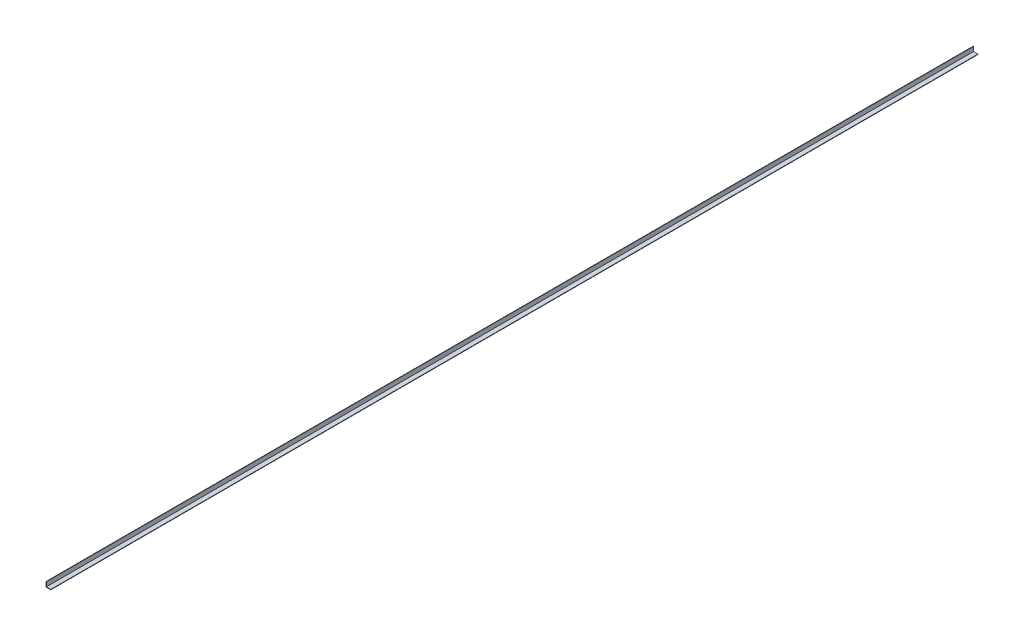
ISO-10303-21;
HEADER;
FILE_DESCRIPTION(('STEP AP214'),'2;1');
FILE_NAME('part.step','',(''),(''),'','','');
FILE_SCHEMA(('AUTOMOTIVE_DESIGN { 1 0 10303 214 1 1 1 1 }'));
ENDSEC;
DATA;
#1=APPLICATION_CONTEXT('core data for automotive mechanical design processes');
#2=APPLICATION_PROTOCOL_DEFINITION('international standard','automotive_design',2000,#1);
#3=PRODUCT_CONTEXT('',#1,'mechanical');
#4=PRODUCT('Part','Part','',(#3));
#5=PRODUCT_RELATED_PRODUCT_CATEGORY('part','',(#4));
#6=PRODUCT_DEFINITION_FORMATION('','',#4);
#7=PRODUCT_DEFINITION_CONTEXT('part definition',#1,'design');
#8=PRODUCT_DEFINITION('design','',#6,#7);
#9=PRODUCT_DEFINITION_SHAPE('','',#8);
#10=(LENGTH_UNIT() NAMED_UNIT(*) SI_UNIT(.MILLI.,.METRE.));
#11=(NAMED_UNIT(*) PLANE_ANGLE_UNIT() SI_UNIT($,.RADIAN.));
#12=(NAMED_UNIT(*) SI_UNIT($,.STERADIAN.) SOLID_ANGLE_UNIT());
#13=UNCERTAINTY_MEASURE_WITH_UNIT(LENGTH_MEASURE(1.E-05),#10,'distance_accuracy_value','');
#14=(GEOMETRIC_REPRESENTATION_CONTEXT(3) GLOBAL_UNCERTAINTY_ASSIGNED_CONTEXT((#13)) GLOBAL_UNIT_ASSIGNED_CONTEXT((#10,
#11,#12)) REPRESENTATION_CONTEXT('',''));
#15=CARTESIAN_POINT('',(0.,0.,0.));
#16=DIRECTION('',(0.,0.,1.));
#17=DIRECTION('',(1.,0.,0.));
#18=AXIS2_PLACEMENT_3D('',#15,#16,#17);
#19=CARTESIAN_POINT('',(2.7,31.75,-6100.));
#20=DIRECTION('',(0.,1.,0.));
#21=DIRECTION('',(0.,0.,1.));
#22=AXIS2_PLACEMENT_3D('',#19,#20,#21);
#23=PLANE('',#22);
#24=DIRECTION('',(-1.,0.,0.));
#25=VECTOR('',#24,1.);
#26=CARTESIAN_POINT('',(2.7,31.75,0.));
#27=LINE('',#26,#25);
#28=CARTESIAN_POINT('',(2.7,31.75,0.));
#29=VERTEX_POINT('',#28);
#30=CARTESIAN_POINT('',(0.,31.75,0.));
#31=VERTEX_POINT('',#30);
#32=EDGE_CURVE('E120',#29,#31,#27,.T.);
#33=ORIENTED_EDGE('',*,*,#32,.F.);
#34=DIRECTION('',(0.,0.,1.));
#35=VECTOR('',#34,1.);
#36=CARTESIAN_POINT('',(2.7,31.75,-6100.));
#37=LINE('',#36,#35);
#38=CARTESIAN_POINT('',(2.7,31.75,-6100.));
#39=VERTEX_POINT('',#38);
#40=EDGE_CURVE('E11',#39,#29,#37,.T.);
#41=ORIENTED_EDGE('',*,*,#40,.F.);
#42=DIRECTION('',(-1.,0.,0.));
#43=VECTOR('',#42,1.);
#44=CARTESIAN_POINT('',(2.7,31.75,-6100.));
#45=LINE('',#44,#43);
#46=CARTESIAN_POINT('',(0.,31.75,-6100.));
#47=VERTEX_POINT('',#46);
#48=EDGE_CURVE('E134',#39,#47,#45,.T.);
#49=ORIENTED_EDGE('',*,*,#48,.T.);
#50=DIRECTION('',(0.,0.,1.));
#51=VECTOR('',#50,1.);
#52=CARTESIAN_POINT('',(0.,31.75,-6100.));
#53=LINE('',#52,#51);
#54=EDGE_CURVE('E38',#47,#31,#53,.T.);
#55=ORIENTED_EDGE('',*,*,#54,.T.);
#56=EDGE_LOOP('',(#33,#41,#49,#55));
#57=FACE_BOUND('',#56,.T.);
#58=ADVANCED_FACE('F35',(#57),#23,.T.);
#59=CARTESIAN_POINT('',(2.7,2.7,-6100.));
#60=DIRECTION('',(1.,0.,0.));
#61=DIRECTION('',(0.,1.,0.));
#62=AXIS2_PLACEMENT_3D('',#59,#60,#61);
#63=PLANE('',#62);
#64=DIRECTION('',(0.,1.,0.));
#65=VECTOR('',#64,1.);
#66=CARTESIAN_POINT('',(2.7,2.7,0.));
#67=LINE('',#66,#65);
#68=CARTESIAN_POINT('',(2.7,2.7,0.));
#69=VERTEX_POINT('',#68);
#70=EDGE_CURVE('E132',#69,#29,#67,.T.);
#71=ORIENTED_EDGE('',*,*,#70,.F.);
#72=DIRECTION('',(0.,0.,1.));
#73=VECTOR('',#72,1.);
#74=CARTESIAN_POINT('',(2.7,2.7,-6100.));
#75=LINE('',#74,#73);
#76=CARTESIAN_POINT('',(2.7,2.7,-6100.));
#77=VERTEX_POINT('',#76);
#78=EDGE_CURVE('E44',#77,#69,#75,.T.);
#79=ORIENTED_EDGE('',*,*,#78,.F.);
#80=DIRECTION('',(0.,1.,0.));
#81=VECTOR('',#80,1.);
#82=CARTESIAN_POINT('',(2.7,2.7,-6100.));
#83=LINE('',#82,#81);
#84=EDGE_CURVE('E110',#77,#39,#83,.T.);
#85=ORIENTED_EDGE('',*,*,#84,.T.);
#86=ORIENTED_EDGE('',*,*,#40,.T.);
#87=EDGE_LOOP('',(#71,#79,#85,#86));
#88=FACE_BOUND('',#87,.T.);
#89=ADVANCED_FACE('F142',(#88),#63,.T.);
#90=CARTESIAN_POINT('',(31.75,2.7,-6100.));
#91=DIRECTION('',(0.,1.,0.));
#92=DIRECTION('',(-1.,0.,0.));
#93=AXIS2_PLACEMENT_3D('',#90,#91,#92);
#94=PLANE('',#93);
#95=DIRECTION('',(-1.,0.,0.));
#96=VECTOR('',#95,1.);
#97=CARTESIAN_POINT('',(31.75,2.7,0.));
#98=LINE('',#97,#96);
#99=CARTESIAN_POINT('',(31.75,2.7,0.));
#100=VERTEX_POINT('',#99);
#101=EDGE_CURVE('E97',#100,#69,#98,.T.);
#102=ORIENTED_EDGE('',*,*,#101,.F.);
#103=DIRECTION('',(0.,0.,1.));
#104=VECTOR('',#103,1.);
#105=CARTESIAN_POINT('',(31.75,2.7,-6100.));
#106=LINE('',#105,#104);
#107=CARTESIAN_POINT('',(31.75,2.7,-6100.));
#108=VERTEX_POINT('',#107);
#109=EDGE_CURVE('E92',#108,#100,#106,.T.);
#110=ORIENTED_EDGE('',*,*,#109,.F.);
#111=DIRECTION('',(-1.,0.,0.));
#112=VECTOR('',#111,1.);
#113=CARTESIAN_POINT('',(31.75,2.7,-6100.));
#114=LINE('',#113,#112);
#115=EDGE_CURVE('E95',#108,#77,#114,.T.);
#116=ORIENTED_EDGE('',*,*,#115,.T.);
#117=ORIENTED_EDGE('',*,*,#78,.T.);
#118=EDGE_LOOP('',(#102,#110,#116,#117));
#119=FACE_BOUND('',#118,.T.);
#120=ADVANCED_FACE('F94',(#119),#94,.T.);
#121=CARTESIAN_POINT('',(31.75,0.,-6100.));
#122=DIRECTION('',(1.,0.,0.));
#123=DIRECTION('',(0.,0.,-1.));
#124=AXIS2_PLACEMENT_3D('',#121,#122,#123);
#125=PLANE('',#124);
#126=DIRECTION('',(0.,1.,0.));
#127=VECTOR('',#126,1.);
#128=CARTESIAN_POINT('',(31.75,0.,0.));
#129=LINE('',#128,#127);
#130=CARTESIAN_POINT('',(31.75,0.,0.));
#131=VERTEX_POINT('',#130);
#132=EDGE_CURVE('E129',#131,#100,#129,.T.);
#133=ORIENTED_EDGE('',*,*,#132,.F.);
#134=DIRECTION('',(0.,0.,1.));
#135=VECTOR('',#134,1.);
#136=CARTESIAN_POINT('',(31.75,0.,-6100.));
#137=LINE('',#136,#135);
#138=CARTESIAN_POINT('',(31.75,0.,-6100.));
#139=VERTEX_POINT('',#138);
#140=EDGE_CURVE('E102',#139,#131,#137,.T.);
#141=ORIENTED_EDGE('',*,*,#140,.F.);
#142=DIRECTION('',(0.,1.,0.));
#143=VECTOR('',#142,1.);
#144=CARTESIAN_POINT('',(31.75,0.,-6100.));
#145=LINE('',#144,#143);
#146=EDGE_CURVE('E108',#139,#108,#145,.T.);
#147=ORIENTED_EDGE('',*,*,#146,.T.);
#148=ORIENTED_EDGE('',*,*,#109,.T.);
#149=EDGE_LOOP('',(#133,#141,#147,#148));
#150=FACE_BOUND('',#149,.T.);
#151=ADVANCED_FACE('F112',(#150),#125,.T.);
#152=CARTESIAN_POINT('',(0.,0.,-6100.));
#153=DIRECTION('',(0.,-1.,0.));
#154=DIRECTION('',(0.,0.,-1.));
#155=AXIS2_PLACEMENT_3D('',#152,#153,#154);
#156=PLANE('',#155);
#157=DIRECTION('',(1.,0.,0.));
#158=VECTOR('',#157,1.);
#159=CARTESIAN_POINT('',(0.,0.,0.));
#160=LINE('',#159,#158);
#161=CARTESIAN_POINT('',(0.,0.,0.));
#162=VERTEX_POINT('',#161);
#163=EDGE_CURVE('E126',#162,#131,#160,.T.);
#164=ORIENTED_EDGE('',*,*,#163,.F.);
#165=DIRECTION('',(0.,0.,1.));
#166=VECTOR('',#165,1.);
#167=CARTESIAN_POINT('',(0.,0.,-6100.));
#168=LINE('',#167,#166);
#169=CARTESIAN_POINT('',(0.,0.,-6100.));
#170=VERTEX_POINT('',#169);
#171=EDGE_CURVE('E137',#170,#162,#168,.T.);
#172=ORIENTED_EDGE('',*,*,#171,.F.);
#173=DIRECTION('',(1.,0.,0.));
#174=VECTOR('',#173,1.);
#175=CARTESIAN_POINT('',(0.,0.,-6100.));
#176=LINE('',#175,#174);
#177=EDGE_CURVE('E113',#170,#139,#176,.T.);
#178=ORIENTED_EDGE('',*,*,#177,.T.);
#179=ORIENTED_EDGE('',*,*,#140,.T.);
#180=EDGE_LOOP('',(#164,#172,#178,#179));
#181=FACE_BOUND('',#180,.T.);
#182=ADVANCED_FACE('F155',(#181),#156,.T.);
#183=CARTESIAN_POINT('',(0.,31.75,-6100.));
#184=DIRECTION('',(-1.,0.,0.));
#185=DIRECTION('',(0.,-1.,0.));
#186=AXIS2_PLACEMENT_3D('',#183,#184,#185);
#187=PLANE('',#186);
#188=DIRECTION('',(0.,-1.,0.));
#189=VECTOR('',#188,1.);
#190=CARTESIAN_POINT('',(0.,31.75,0.));
#191=LINE('',#190,#189);
#192=EDGE_CURVE('E123',#31,#162,#191,.T.);
#193=ORIENTED_EDGE('',*,*,#192,.F.);
#194=ORIENTED_EDGE('',*,*,#54,.F.);
#195=DIRECTION('',(0.,-1.,0.));
#196=VECTOR('',#195,1.);
#197=CARTESIAN_POINT('',(0.,31.75,-6100.));
#198=LINE('',#197,#196);
#199=EDGE_CURVE('E115',#47,#170,#198,.T.);
#200=ORIENTED_EDGE('',*,*,#199,.T.);
#201=ORIENTED_EDGE('',*,*,#171,.T.);
#202=EDGE_LOOP('',(#193,#194,#200,#201));
#203=FACE_BOUND('',#202,.T.);
#204=ADVANCED_FACE('F139',(#203),#187,.T.);
#205=CARTESIAN_POINT('',(0.,0.,-6100.));
#206=DIRECTION('',(0.,0.,1.));
#207=DIRECTION('',(1.,0.,0.));
#208=AXIS2_PLACEMENT_3D('',#205,#206,#207);
#209=PLANE('',#208);
#210=ORIENTED_EDGE('',*,*,#48,.F.);
#211=ORIENTED_EDGE('',*,*,#84,.F.);
#212=ORIENTED_EDGE('',*,*,#115,.F.);
#213=ORIENTED_EDGE('',*,*,#146,.F.);
#214=ORIENTED_EDGE('',*,*,#177,.F.);
#215=ORIENTED_EDGE('',*,*,#199,.F.);
#216=EDGE_LOOP('',(#210,#211,#212,#213,#214,#215));
#217=FACE_BOUND('',#216,.T.);
#218=ADVANCED_FACE('F106',(#217),#209,.F.);
#219=CARTESIAN_POINT('',(0.,0.,0.));
#220=DIRECTION('',(0.,0.,1.));
#221=DIRECTION('',(1.,0.,0.));
#222=AXIS2_PLACEMENT_3D('',#219,#220,#221);
#223=PLANE('',#222);
#224=ORIENTED_EDGE('',*,*,#32,.T.);
#225=ORIENTED_EDGE('',*,*,#192,.T.);
#226=ORIENTED_EDGE('',*,*,#163,.T.);
#227=ORIENTED_EDGE('',*,*,#132,.T.);
#228=ORIENTED_EDGE('',*,*,#101,.T.);
#229=ORIENTED_EDGE('',*,*,#70,.T.);
#230=EDGE_LOOP('',(#224,#225,#226,#227,#228,#229));
#231=FACE_BOUND('',#230,.T.);
#232=ADVANCED_FACE('F141',(#231),#223,.T.);
#233=CLOSED_SHELL('',(#58,#89,#120,#151,#182,#204,#218,#232));
#234=MANIFOLD_SOLID_BREP('B2',#233);
#235=ADVANCED_BREP_SHAPE_REPRESENTATION('',(#18,#234),#14);
#236=SHAPE_DEFINITION_REPRESENTATION(#9,#235);
ENDSEC;
END-ISO-10303-21;
